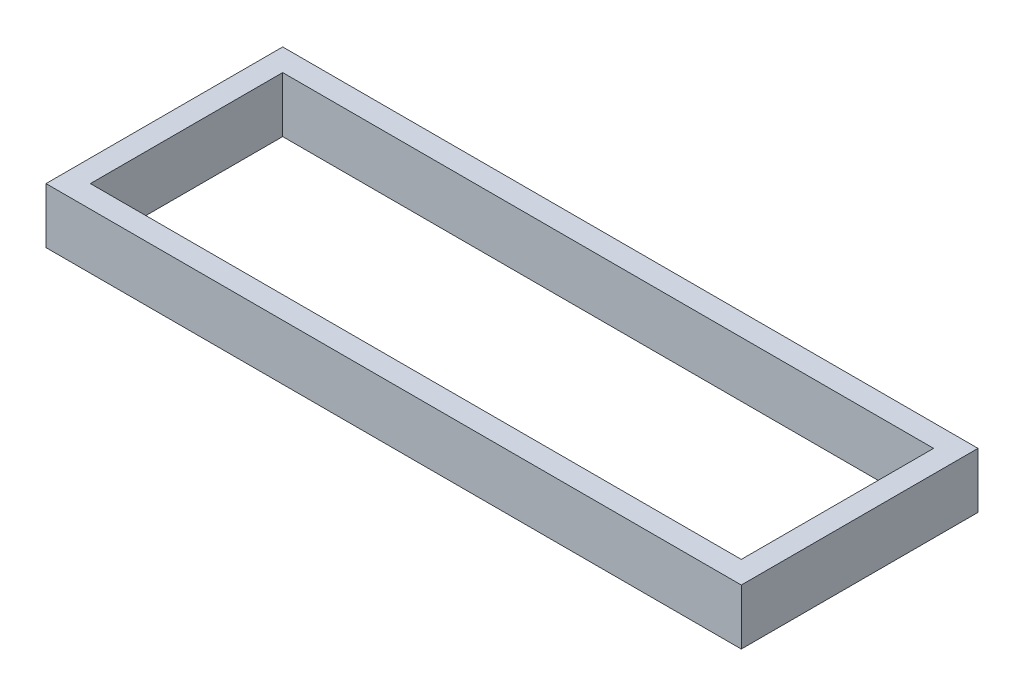
ISO-10303-21;
HEADER;
FILE_DESCRIPTION(('STEP AP214'),'2;1');
FILE_NAME('part.step','',(''),(''),'','','');
FILE_SCHEMA(('AUTOMOTIVE_DESIGN { 1 0 10303 214 1 1 1 1 }'));
ENDSEC;
DATA;
#1=APPLICATION_CONTEXT('core data for automotive mechanical design processes');
#2=APPLICATION_PROTOCOL_DEFINITION('international standard','automotive_design',2000,#1);
#3=PRODUCT_CONTEXT('',#1,'mechanical');
#4=PRODUCT('Part','Part','',(#3));
#5=PRODUCT_RELATED_PRODUCT_CATEGORY('part','',(#4));
#6=PRODUCT_DEFINITION_FORMATION('','',#4);
#7=PRODUCT_DEFINITION_CONTEXT('part definition',#1,'design');
#8=PRODUCT_DEFINITION('design','',#6,#7);
#9=PRODUCT_DEFINITION_SHAPE('','',#8);
#10=(LENGTH_UNIT() NAMED_UNIT(*) SI_UNIT(.MILLI.,.METRE.));
#11=(NAMED_UNIT(*) PLANE_ANGLE_UNIT() SI_UNIT($,.RADIAN.));
#12=(NAMED_UNIT(*) SI_UNIT($,.STERADIAN.) SOLID_ANGLE_UNIT());
#13=UNCERTAINTY_MEASURE_WITH_UNIT(LENGTH_MEASURE(1.E-05),#10,'distance_accuracy_value','');
#14=(GEOMETRIC_REPRESENTATION_CONTEXT(3) GLOBAL_UNCERTAINTY_ASSIGNED_CONTEXT((#13)) GLOBAL_UNIT_ASSIGNED_CONTEXT((#10,
#11,#12)) REPRESENTATION_CONTEXT('',''));
#15=CARTESIAN_POINT('',(0.,0.,0.));
#16=DIRECTION('',(0.,0.,1.));
#17=DIRECTION('',(1.,0.,0.));
#18=AXIS2_PLACEMENT_3D('',#15,#16,#17);
#19=CARTESIAN_POINT('',(0.,15.,0.));
#20=DIRECTION('',(0.,1.,0.));
#21=DIRECTION('',(0.,0.,1.));
#22=AXIS2_PLACEMENT_3D('',#19,#20,#21);
#23=PLANE('',#22);
#24=DIRECTION('',(1.,0.,0.));
#25=VECTOR('',#24,1.);
#26=CARTESIAN_POINT('',(-94.,15.,32.));
#27=LINE('',#26,#25);
#28=CARTESIAN_POINT('',(-94.,15.,32.));
#29=VERTEX_POINT('',#28);
#30=CARTESIAN_POINT('',(94.,15.,32.));
#31=VERTEX_POINT('',#30);
#32=EDGE_CURVE('E140',#29,#31,#27,.T.);
#33=ORIENTED_EDGE('',*,*,#32,.T.);
#34=DIRECTION('',(0.,0.,-1.));
#35=VECTOR('',#34,1.);
#36=CARTESIAN_POINT('',(94.,15.,32.));
#37=LINE('',#36,#35);
#38=CARTESIAN_POINT('',(94.,15.,-32.));
#39=VERTEX_POINT('',#38);
#40=EDGE_CURVE('E143',#31,#39,#37,.T.);
#41=ORIENTED_EDGE('',*,*,#40,.T.);
#42=DIRECTION('',(-1.,0.,0.));
#43=VECTOR('',#42,1.);
#44=CARTESIAN_POINT('',(-94.,15.,-32.));
#45=LINE('',#44,#43);
#46=CARTESIAN_POINT('',(-94.,15.,-32.));
#47=VERTEX_POINT('',#46);
#48=EDGE_CURVE('E146',#39,#47,#45,.T.);
#49=ORIENTED_EDGE('',*,*,#48,.T.);
#50=DIRECTION('',(0.,0.,1.));
#51=VECTOR('',#50,1.);
#52=CARTESIAN_POINT('',(-94.,15.,32.));
#53=LINE('',#52,#51);
#54=EDGE_CURVE('E148',#47,#29,#53,.T.);
#55=ORIENTED_EDGE('',*,*,#54,.T.);
#56=EDGE_LOOP('',(#33,#41,#49,#55));
#57=FACE_BOUND('',#56,.T.);
#58=DIRECTION('',(-1.,0.,0.));
#59=VECTOR('',#58,1.);
#60=CARTESIAN_POINT('',(-88.,15.,-26.));
#61=LINE('',#60,#59);
#62=CARTESIAN_POINT('',(88.,15.,-26.));
#63=VERTEX_POINT('',#62);
#64=CARTESIAN_POINT('',(-88.,15.,-26.));
#65=VERTEX_POINT('',#64);
#66=EDGE_CURVE('E112',#63,#65,#61,.T.);
#67=ORIENTED_EDGE('',*,*,#66,.F.);
#68=DIRECTION('',(0.,0.,-1.));
#69=VECTOR('',#68,1.);
#70=CARTESIAN_POINT('',(88.,15.,26.));
#71=LINE('',#70,#69);
#72=CARTESIAN_POINT('',(88.,15.,26.));
#73=VERTEX_POINT('',#72);
#74=EDGE_CURVE('E104',#73,#63,#71,.T.);
#75=ORIENTED_EDGE('',*,*,#74,.F.);
#76=DIRECTION('',(1.,0.,0.));
#77=VECTOR('',#76,1.);
#78=CARTESIAN_POINT('',(-88.,15.,26.));
#79=LINE('',#78,#77);
#80=CARTESIAN_POINT('',(-88.,15.,26.));
#81=VERTEX_POINT('',#80);
#82=EDGE_CURVE('E126',#81,#73,#79,.T.);
#83=ORIENTED_EDGE('',*,*,#82,.F.);
#84=DIRECTION('',(0.,0.,1.));
#85=VECTOR('',#84,1.);
#86=CARTESIAN_POINT('',(-88.,15.,26.));
#87=LINE('',#86,#85);
#88=EDGE_CURVE('E124',#65,#81,#87,.T.);
#89=ORIENTED_EDGE('',*,*,#88,.F.);
#90=EDGE_LOOP('',(#67,#75,#83,#89));
#91=FACE_BOUND('',#90,.T.);
#92=ADVANCED_FACE('F39',(#57,#91),#23,.T.);
#93=CARTESIAN_POINT('',(0.,0.,0.));
#94=DIRECTION('',(0.,1.,0.));
#95=DIRECTION('',(0.,0.,1.));
#96=AXIS2_PLACEMENT_3D('',#93,#94,#95);
#97=PLANE('',#96);
#98=DIRECTION('',(1.,0.,0.));
#99=VECTOR('',#98,1.);
#100=CARTESIAN_POINT('',(-94.,0.,32.));
#101=LINE('',#100,#99);
#102=CARTESIAN_POINT('',(-94.,0.,32.));
#103=VERTEX_POINT('',#102);
#104=CARTESIAN_POINT('',(94.,0.,32.));
#105=VERTEX_POINT('',#104);
#106=EDGE_CURVE('E120',#103,#105,#101,.T.);
#107=ORIENTED_EDGE('',*,*,#106,.F.);
#108=DIRECTION('',(0.,0.,1.));
#109=VECTOR('',#108,1.);
#110=CARTESIAN_POINT('',(-94.,0.,32.));
#111=LINE('',#110,#109);
#112=CARTESIAN_POINT('',(-94.,0.,-32.));
#113=VERTEX_POINT('',#112);
#114=EDGE_CURVE('E144',#113,#103,#111,.T.);
#115=ORIENTED_EDGE('',*,*,#114,.F.);
#116=DIRECTION('',(-1.,0.,0.));
#117=VECTOR('',#116,1.);
#118=CARTESIAN_POINT('',(-94.,0.,-32.));
#119=LINE('',#118,#117);
#120=CARTESIAN_POINT('',(94.,0.,-32.));
#121=VERTEX_POINT('',#120);
#122=EDGE_CURVE('E155',#121,#113,#119,.T.);
#123=ORIENTED_EDGE('',*,*,#122,.F.);
#124=DIRECTION('',(0.,0.,-1.));
#125=VECTOR('',#124,1.);
#126=CARTESIAN_POINT('',(94.,0.,32.));
#127=LINE('',#126,#125);
#128=EDGE_CURVE('E153',#105,#121,#127,.T.);
#129=ORIENTED_EDGE('',*,*,#128,.F.);
#130=EDGE_LOOP('',(#107,#115,#123,#129));
#131=FACE_BOUND('',#130,.T.);
#132=DIRECTION('',(0.,0.,-1.));
#133=VECTOR('',#132,1.);
#134=CARTESIAN_POINT('',(88.,0.,26.));
#135=LINE('',#134,#133);
#136=CARTESIAN_POINT('',(88.,0.,26.));
#137=VERTEX_POINT('',#136);
#138=CARTESIAN_POINT('',(88.,0.,-26.));
#139=VERTEX_POINT('',#138);
#140=EDGE_CURVE('E62',#137,#139,#135,.T.);
#141=ORIENTED_EDGE('',*,*,#140,.T.);
#142=DIRECTION('',(-1.,0.,0.));
#143=VECTOR('',#142,1.);
#144=CARTESIAN_POINT('',(-88.,0.,-26.));
#145=LINE('',#144,#143);
#146=CARTESIAN_POINT('',(-88.,0.,-26.));
#147=VERTEX_POINT('',#146);
#148=EDGE_CURVE('E119',#139,#147,#145,.T.);
#149=ORIENTED_EDGE('',*,*,#148,.T.);
#150=DIRECTION('',(0.,0.,1.));
#151=VECTOR('',#150,1.);
#152=CARTESIAN_POINT('',(-88.,0.,26.));
#153=LINE('',#152,#151);
#154=CARTESIAN_POINT('',(-88.,0.,26.));
#155=VERTEX_POINT('',#154);
#156=EDGE_CURVE('E132',#147,#155,#153,.T.);
#157=ORIENTED_EDGE('',*,*,#156,.T.);
#158=DIRECTION('',(1.,0.,0.));
#159=VECTOR('',#158,1.);
#160=CARTESIAN_POINT('',(-88.,0.,26.));
#161=LINE('',#160,#159);
#162=EDGE_CURVE('E113',#155,#137,#161,.T.);
#163=ORIENTED_EDGE('',*,*,#162,.T.);
#164=EDGE_LOOP('',(#141,#149,#157,#163));
#165=FACE_BOUND('',#164,.T.);
#166=ADVANCED_FACE('F173',(#131,#165),#97,.F.);
#167=CARTESIAN_POINT('',(-94.,15.,32.));
#168=DIRECTION('',(0.,0.,-1.));
#169=DIRECTION('',(-1.,0.,0.));
#170=AXIS2_PLACEMENT_3D('',#167,#168,#169);
#171=PLANE('',#170);
#172=ORIENTED_EDGE('',*,*,#106,.T.);
#173=DIRECTION('',(0.,-1.,0.));
#174=VECTOR('',#173,1.);
#175=CARTESIAN_POINT('',(94.,15.,32.));
#176=LINE('',#175,#174);
#177=EDGE_CURVE('E11',#31,#105,#176,.T.);
#178=ORIENTED_EDGE('',*,*,#177,.F.);
#179=ORIENTED_EDGE('',*,*,#32,.F.);
#180=DIRECTION('',(0.,-1.,0.));
#181=VECTOR('',#180,1.);
#182=CARTESIAN_POINT('',(-94.,15.,32.));
#183=LINE('',#182,#181);
#184=EDGE_CURVE('E150',#29,#103,#183,.T.);
#185=ORIENTED_EDGE('',*,*,#184,.T.);
#186=EDGE_LOOP('',(#172,#178,#179,#185));
#187=FACE_BOUND('',#186,.T.);
#188=ADVANCED_FACE('F41',(#187),#171,.F.);
#189=CARTESIAN_POINT('',(94.,15.,32.));
#190=DIRECTION('',(-1.,0.,0.));
#191=DIRECTION('',(0.,0.,1.));
#192=AXIS2_PLACEMENT_3D('',#189,#190,#191);
#193=PLANE('',#192);
#194=ORIENTED_EDGE('',*,*,#128,.T.);
#195=DIRECTION('',(0.,-1.,0.));
#196=VECTOR('',#195,1.);
#197=CARTESIAN_POINT('',(94.,15.,-32.));
#198=LINE('',#197,#196);
#199=EDGE_CURVE('E47',#39,#121,#198,.T.);
#200=ORIENTED_EDGE('',*,*,#199,.F.);
#201=ORIENTED_EDGE('',*,*,#40,.F.);
#202=ORIENTED_EDGE('',*,*,#177,.T.);
#203=EDGE_LOOP('',(#194,#200,#201,#202));
#204=FACE_BOUND('',#203,.T.);
#205=ADVANCED_FACE('F183',(#204),#193,.F.);
#206=CARTESIAN_POINT('',(-94.,15.,-32.));
#207=DIRECTION('',(0.,0.,1.));
#208=DIRECTION('',(1.,0.,0.));
#209=AXIS2_PLACEMENT_3D('',#206,#207,#208);
#210=PLANE('',#209);
#211=ORIENTED_EDGE('',*,*,#122,.T.);
#212=DIRECTION('',(0.,-1.,0.));
#213=VECTOR('',#212,1.);
#214=CARTESIAN_POINT('',(-94.,15.,-32.));
#215=LINE('',#214,#213);
#216=EDGE_CURVE('E160',#47,#113,#215,.T.);
#217=ORIENTED_EDGE('',*,*,#216,.F.);
#218=ORIENTED_EDGE('',*,*,#48,.F.);
#219=ORIENTED_EDGE('',*,*,#199,.T.);
#220=EDGE_LOOP('',(#211,#217,#218,#219));
#221=FACE_BOUND('',#220,.T.);
#222=ADVANCED_FACE('F167',(#221),#210,.F.);
#223=CARTESIAN_POINT('',(-94.,15.,32.));
#224=DIRECTION('',(1.,0.,0.));
#225=DIRECTION('',(0.,0.,-1.));
#226=AXIS2_PLACEMENT_3D('',#223,#224,#225);
#227=PLANE('',#226);
#228=ORIENTED_EDGE('',*,*,#114,.T.);
#229=ORIENTED_EDGE('',*,*,#184,.F.);
#230=ORIENTED_EDGE('',*,*,#54,.F.);
#231=ORIENTED_EDGE('',*,*,#216,.T.);
#232=EDGE_LOOP('',(#228,#229,#230,#231));
#233=FACE_BOUND('',#232,.T.);
#234=ADVANCED_FACE('F177',(#233),#227,.F.);
#235=CARTESIAN_POINT('',(88.,15.,26.));
#236=DIRECTION('',(-1.,0.,0.));
#237=DIRECTION('',(0.,0.,1.));
#238=AXIS2_PLACEMENT_3D('',#235,#236,#237);
#239=PLANE('',#238);
#240=ORIENTED_EDGE('',*,*,#140,.F.);
#241=DIRECTION('',(0.,-1.,0.));
#242=VECTOR('',#241,1.);
#243=CARTESIAN_POINT('',(88.,15.,26.));
#244=LINE('',#243,#242);
#245=EDGE_CURVE('E108',#73,#137,#244,.T.);
#246=ORIENTED_EDGE('',*,*,#245,.F.);
#247=ORIENTED_EDGE('',*,*,#74,.T.);
#248=DIRECTION('',(0.,-1.,0.));
#249=VECTOR('',#248,1.);
#250=CARTESIAN_POINT('',(88.,15.,-26.));
#251=LINE('',#250,#249);
#252=EDGE_CURVE('E107',#63,#139,#251,.T.);
#253=ORIENTED_EDGE('',*,*,#252,.T.);
#254=EDGE_LOOP('',(#240,#246,#247,#253));
#255=FACE_BOUND('',#254,.T.);
#256=ADVANCED_FACE('F106',(#255),#239,.T.);
#257=CARTESIAN_POINT('',(-88.,15.,-26.));
#258=DIRECTION('',(0.,0.,1.));
#259=DIRECTION('',(1.,0.,0.));
#260=AXIS2_PLACEMENT_3D('',#257,#258,#259);
#261=PLANE('',#260);
#262=ORIENTED_EDGE('',*,*,#148,.F.);
#263=ORIENTED_EDGE('',*,*,#252,.F.);
#264=ORIENTED_EDGE('',*,*,#66,.T.);
#265=DIRECTION('',(0.,-1.,0.));
#266=VECTOR('',#265,1.);
#267=CARTESIAN_POINT('',(-88.,15.,-26.));
#268=LINE('',#267,#266);
#269=EDGE_CURVE('E121',#65,#147,#268,.T.);
#270=ORIENTED_EDGE('',*,*,#269,.T.);
#271=EDGE_LOOP('',(#262,#263,#264,#270));
#272=FACE_BOUND('',#271,.T.);
#273=ADVANCED_FACE('F116',(#272),#261,.T.);
#274=CARTESIAN_POINT('',(-88.,15.,26.));
#275=DIRECTION('',(1.,0.,0.));
#276=DIRECTION('',(0.,0.,-1.));
#277=AXIS2_PLACEMENT_3D('',#274,#275,#276);
#278=PLANE('',#277);
#279=ORIENTED_EDGE('',*,*,#156,.F.);
#280=ORIENTED_EDGE('',*,*,#269,.F.);
#281=ORIENTED_EDGE('',*,*,#88,.T.);
#282=DIRECTION('',(0.,-1.,0.));
#283=VECTOR('',#282,1.);
#284=CARTESIAN_POINT('',(-88.,15.,26.));
#285=LINE('',#284,#283);
#286=EDGE_CURVE('E54',#81,#155,#285,.T.);
#287=ORIENTED_EDGE('',*,*,#286,.T.);
#288=EDGE_LOOP('',(#279,#280,#281,#287));
#289=FACE_BOUND('',#288,.T.);
#290=ADVANCED_FACE('F206',(#289),#278,.T.);
#291=CARTESIAN_POINT('',(-88.,15.,26.));
#292=DIRECTION('',(0.,0.,-1.));
#293=DIRECTION('',(-1.,0.,0.));
#294=AXIS2_PLACEMENT_3D('',#291,#292,#293);
#295=PLANE('',#294);
#296=ORIENTED_EDGE('',*,*,#162,.F.);
#297=ORIENTED_EDGE('',*,*,#286,.F.);
#298=ORIENTED_EDGE('',*,*,#82,.T.);
#299=ORIENTED_EDGE('',*,*,#245,.T.);
#300=EDGE_LOOP('',(#296,#297,#298,#299));
#301=FACE_BOUND('',#300,.T.);
#302=ADVANCED_FACE('F210',(#301),#295,.T.);
#303=CLOSED_SHELL('',(#92,#166,#188,#205,#222,#234,#256,#273,#290,#302));
#304=MANIFOLD_SOLID_BREP('B2',#303);
#305=ADVANCED_BREP_SHAPE_REPRESENTATION('',(#18,#304),#14);
#306=SHAPE_DEFINITION_REPRESENTATION(#9,#305);
ENDSEC;
END-ISO-10303-21;
